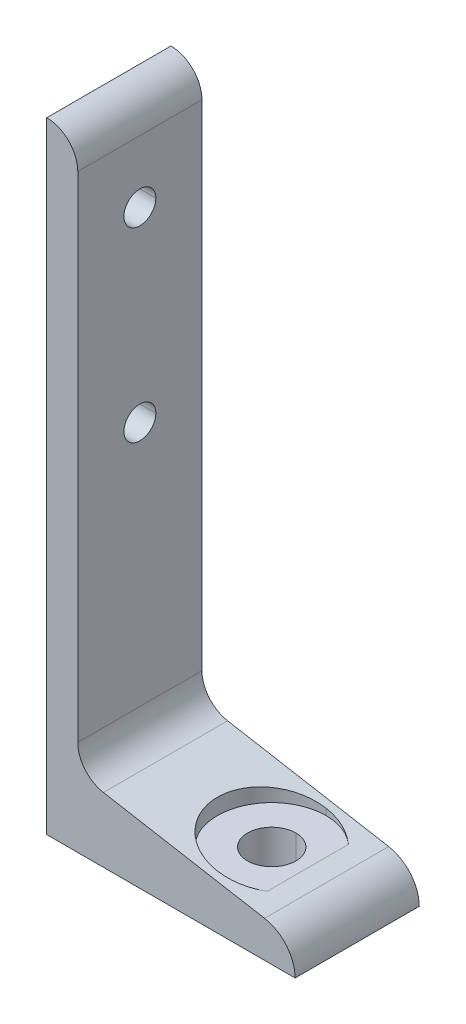
ISO-10303-21;
HEADER;
FILE_DESCRIPTION(('STEP AP214'),'2;1');
FILE_NAME('part.step','',(''),(''),'','','');
FILE_SCHEMA(('AUTOMOTIVE_DESIGN { 1 0 10303 214 1 1 1 1 }'));
ENDSEC;
DATA;
#1=APPLICATION_CONTEXT('core data for automotive mechanical design processes');
#2=APPLICATION_PROTOCOL_DEFINITION('international standard','automotive_design',2000,#1);
#3=PRODUCT_CONTEXT('',#1,'mechanical');
#4=PRODUCT('Part','Part','',(#3));
#5=PRODUCT_RELATED_PRODUCT_CATEGORY('part','',(#4));
#6=PRODUCT_DEFINITION_FORMATION('','',#4);
#7=PRODUCT_DEFINITION_CONTEXT('part definition',#1,'design');
#8=PRODUCT_DEFINITION('design','',#6,#7);
#9=PRODUCT_DEFINITION_SHAPE('','',#8);
#10=(LENGTH_UNIT() NAMED_UNIT(*) SI_UNIT(.MILLI.,.METRE.));
#11=(NAMED_UNIT(*) PLANE_ANGLE_UNIT() SI_UNIT($,.RADIAN.));
#12=(NAMED_UNIT(*) SI_UNIT($,.STERADIAN.) SOLID_ANGLE_UNIT());
#13=UNCERTAINTY_MEASURE_WITH_UNIT(LENGTH_MEASURE(1.E-05),#10,'distance_accuracy_value','');
#14=(GEOMETRIC_REPRESENTATION_CONTEXT(3) GLOBAL_UNCERTAINTY_ASSIGNED_CONTEXT((#13)) GLOBAL_UNIT_ASSIGNED_CONTEXT((#10,
#11,#12)) REPRESENTATION_CONTEXT('',''));
#15=CARTESIAN_POINT('',(0.,0.,0.));
#16=DIRECTION('',(0.,0.,1.));
#17=DIRECTION('',(1.,0.,0.));
#18=AXIS2_PLACEMENT_3D('',#15,#16,#17);
#19=CARTESIAN_POINT('',(50.8,107.95,0.));
#20=DIRECTION('',(-1.,0.,0.));
#21=DIRECTION('',(0.,0.,1.));
#22=AXIS2_PLACEMENT_3D('',#19,#20,#21);
#23=CYLINDRICAL_SURFACE('',#22,3.2639);
#24=DIRECTION('',(-1.,0.,0.));
#25=VECTOR('',#24,1.);
#26=CARTESIAN_POINT('',(50.8,107.95,-3.2639));
#27=LINE('',#26,#25);
#28=CARTESIAN_POINT('',(6.35,107.95,-3.2639));
#29=VERTEX_POINT('',#28);
#30=CARTESIAN_POINT('',(0.,107.95,-3.2639));
#31=VERTEX_POINT('',#30);
#32=EDGE_CURVE('E175',#29,#31,#27,.T.);
#33=ORIENTED_EDGE('',*,*,#32,.F.);
#34=CARTESIAN_POINT('',(6.35,107.95,0.));
#35=DIRECTION('',(1.,0.,0.));
#36=DIRECTION('',(0.,-1.,0.));
#37=AXIS2_PLACEMENT_3D('',#34,#35,#36);
#38=CIRCLE('',#37,3.2639);
#39=CARTESIAN_POINT('',(6.35,107.95,3.2639));
#40=VERTEX_POINT('',#39);
#41=EDGE_CURVE('E170',#29,#40,#38,.T.);
#42=ORIENTED_EDGE('',*,*,#41,.T.);
#43=DIRECTION('',(-1.,0.,0.));
#44=VECTOR('',#43,1.);
#45=CARTESIAN_POINT('',(50.8,107.95,3.2639));
#46=LINE('',#45,#44);
#47=CARTESIAN_POINT('',(0.,107.95,3.2639));
#48=VERTEX_POINT('',#47);
#49=EDGE_CURVE('E172',#40,#48,#46,.T.);
#50=ORIENTED_EDGE('',*,*,#49,.T.);
#51=CARTESIAN_POINT('',(0.,107.95,0.));
#52=DIRECTION('',(1.,0.,0.));
#53=DIRECTION('',(0.,0.,-1.));
#54=AXIS2_PLACEMENT_3D('',#51,#52,#53);
#55=CIRCLE('',#54,3.2639);
#56=EDGE_CURVE('E267',#31,#48,#55,.T.);
#57=ORIENTED_EDGE('',*,*,#56,.F.);
#58=EDGE_LOOP('',(#33,#42,#50,#57));
#59=FACE_BOUND('',#58,.T.);
#60=ADVANCED_FACE('F16',(#59),#23,.F.);
#61=CARTESIAN_POINT('',(50.8,69.85,0.));
#62=DIRECTION('',(-1.,0.,0.));
#63=DIRECTION('',(0.,0.,1.));
#64=AXIS2_PLACEMENT_3D('',#61,#62,#63);
#65=CYLINDRICAL_SURFACE('',#64,3.2639);
#66=DIRECTION('',(-1.,0.,0.));
#67=VECTOR('',#66,1.);
#68=CARTESIAN_POINT('',(50.8,69.85,-3.2639));
#69=LINE('',#68,#67);
#70=CARTESIAN_POINT('',(6.35,69.85,-3.2639));
#71=VERTEX_POINT('',#70);
#72=CARTESIAN_POINT('',(0.,69.85,-3.2639));
#73=VERTEX_POINT('',#72);
#74=EDGE_CURVE('E207',#71,#73,#69,.T.);
#75=ORIENTED_EDGE('',*,*,#74,.F.);
#76=CARTESIAN_POINT('',(6.35,69.85,0.));
#77=DIRECTION('',(1.,0.,0.));
#78=DIRECTION('',(0.,-1.,0.));
#79=AXIS2_PLACEMENT_3D('',#76,#77,#78);
#80=CIRCLE('',#79,3.2639);
#81=CARTESIAN_POINT('',(6.35,69.85,3.2639));
#82=VERTEX_POINT('',#81);
#83=EDGE_CURVE('E181',#71,#82,#80,.T.);
#84=ORIENTED_EDGE('',*,*,#83,.T.);
#85=DIRECTION('',(-1.,0.,0.));
#86=VECTOR('',#85,1.);
#87=CARTESIAN_POINT('',(50.8,69.85,3.2639));
#88=LINE('',#87,#86);
#89=CARTESIAN_POINT('',(0.,69.85,3.2639));
#90=VERTEX_POINT('',#89);
#91=EDGE_CURVE('E206',#82,#90,#88,.T.);
#92=ORIENTED_EDGE('',*,*,#91,.T.);
#93=CARTESIAN_POINT('',(0.,69.85,0.));
#94=DIRECTION('',(1.,0.,0.));
#95=DIRECTION('',(0.,0.,-1.));
#96=AXIS2_PLACEMENT_3D('',#93,#94,#95);
#97=CIRCLE('',#96,3.2639);
#98=EDGE_CURVE('E316',#73,#90,#97,.T.);
#99=ORIENTED_EDGE('',*,*,#98,.F.);
#100=EDGE_LOOP('',(#75,#84,#92,#99));
#101=FACE_BOUND('',#100,.T.);
#102=ADVANCED_FACE('F500',(#101),#65,.F.);
#103=CARTESIAN_POINT('',(33.3248,8.128,0.));
#104=DIRECTION('',(0.,1.,0.));
#105=DIRECTION('',(1.,0.,0.));
#106=AXIS2_PLACEMENT_3D('',#103,#104,#105);
#107=PLANE('',#106);
#108=CARTESIAN_POINT('',(33.3248,8.128,0.));
#109=DIRECTION('',(0.,1.,0.));
#110=DIRECTION('',(0.,0.,1.));
#111=AXIS2_PLACEMENT_3D('',#108,#109,#110);
#112=CIRCLE('',#111,4.953);
#113=CARTESIAN_POINT('',(33.3248,8.128,-4.953));
#114=VERTEX_POINT('',#113);
#115=CARTESIAN_POINT('',(33.3248,8.128,4.953));
#116=VERTEX_POINT('',#115);
#117=EDGE_CURVE('E259',#114,#116,#112,.T.);
#118=ORIENTED_EDGE('',*,*,#117,.F.);
#119=CARTESIAN_POINT('',(33.3248,8.128,0.));
#120=DIRECTION('',(0.,1.,0.));
#121=DIRECTION('',(0.,0.,1.));
#122=AXIS2_PLACEMENT_3D('',#119,#120,#121);
#123=CIRCLE('',#122,4.953);
#124=EDGE_CURVE('E329',#116,#114,#123,.T.);
#125=ORIENTED_EDGE('',*,*,#124,.F.);
#126=EDGE_LOOP('',(#118,#125));
#127=FACE_BOUND('',#126,.T.);
#128=DIRECTION('',(0.,0.,-1.));
#129=VECTOR('',#128,1.);
#130=CARTESIAN_POINT('',(40.7164609247193,8.128,12.7));
#131=LINE('',#130,#129);
#132=CARTESIAN_POINT('',(40.7164609247193,8.128,8.29765057254029));
#133=VERTEX_POINT('',#132);
#134=CARTESIAN_POINT('',(40.7164609247193,8.128,-8.29765057254029));
#135=VERTEX_POINT('',#134);
#136=EDGE_CURVE('E260',#133,#135,#131,.T.);
#137=ORIENTED_EDGE('',*,*,#136,.T.);
#138=CARTESIAN_POINT('',(33.3248,8.128,0.));
#139=DIRECTION('',(0.,1.,0.));
#140=DIRECTION('',(0.,0.,1.));
#141=AXIS2_PLACEMENT_3D('',#138,#139,#140);
#142=CIRCLE('',#141,11.1125);
#143=CARTESIAN_POINT('',(33.3248,8.128,-11.1125));
#144=VERTEX_POINT('',#143);
#145=EDGE_CURVE('E250',#135,#144,#142,.T.);
#146=ORIENTED_EDGE('',*,*,#145,.T.);
#147=CARTESIAN_POINT('',(33.3248,8.128,0.));
#148=DIRECTION('',(0.,1.,0.));
#149=DIRECTION('',(0.,0.,1.));
#150=AXIS2_PLACEMENT_3D('',#147,#148,#149);
#151=CIRCLE('',#150,11.1125);
#152=CARTESIAN_POINT('',(33.3248,8.128,11.1125));
#153=VERTEX_POINT('',#152);
#154=EDGE_CURVE('E229',#144,#153,#151,.T.);
#155=ORIENTED_EDGE('',*,*,#154,.T.);
#156=CARTESIAN_POINT('',(33.3248,8.128,0.));
#157=DIRECTION('',(0.,1.,0.));
#158=DIRECTION('',(0.,0.,1.));
#159=AXIS2_PLACEMENT_3D('',#156,#157,#158);
#160=CIRCLE('',#159,11.1125);
#161=EDGE_CURVE('E10',#153,#133,#160,.T.);
#162=ORIENTED_EDGE('',*,*,#161,.T.);
#163=EDGE_LOOP('',(#137,#146,#155,#162));
#164=FACE_BOUND('',#163,.T.);
#165=ADVANCED_FACE('F406',(#127,#164),#107,.T.);
#166=CARTESIAN_POINT('',(33.3248,127.,0.));
#167=DIRECTION('',(0.,-1.,0.));
#168=DIRECTION('',(0.,0.,-1.));
#169=AXIS2_PLACEMENT_3D('',#166,#167,#168);
#170=CYLINDRICAL_SURFACE('',#169,11.1125);
#171=DIRECTION('',(0.,-1.,0.));
#172=VECTOR('',#171,1.);
#173=CARTESIAN_POINT('',(33.3248,127.,11.1125));
#174=LINE('',#173,#172);
#175=CARTESIAN_POINT('',(33.3248,9.43134925327645,11.1125));
#176=VERTEX_POINT('',#175);
#177=EDGE_CURVE('E238',#176,#153,#174,.T.);
#178=ORIENTED_EDGE('',*,*,#177,.F.);
#179=CARTESIAN_POINT('',(33.3248,9.43134925327645,11.1125));
#180=CARTESIAN_POINT('',(36.081621391566,8.94524726094913,11.1125));
#181=CARTESIAN_POINT('',(38.6579555840562,8.49097003149137,10.1313953605239));
#182=CARTESIAN_POINT('',(40.7164609247193,8.128,8.29765057254029));
#183=(BOUNDED_CURVE() B_SPLINE_CURVE(3,(#179,#180,#181,#182),.UNSPECIFIED.,.F.,
.F.) B_SPLINE_CURVE_WITH_KNOTS((4,4),(4.71238898038469,5.4401055411194),
.UNSPECIFIED.) CURVE() GEOMETRIC_REPRESENTATION_ITEM() RATIONAL_B_SPLINE_CURVE((1.,
0.956353792178216,0.956353792178216,1.)) REPRESENTATION_ITEM(''));
#184=EDGE_CURVE('E263',#176,#133,#183,.T.);
#185=ORIENTED_EDGE('',*,*,#184,.T.);
#186=ORIENTED_EDGE('',*,*,#161,.F.);
#187=EDGE_LOOP('',(#178,#185,#186));
#188=FACE_BOUND('',#187,.T.);
#189=ADVANCED_FACE('F401',(#188),#170,.F.);
#190=CARTESIAN_POINT('',(0.,120.65,-12.7));
#191=DIRECTION('',(0.,0.,1.));
#192=DIRECTION('',(1.,0.,0.));
#193=AXIS2_PLACEMENT_3D('',#190,#191,#192);
#194=PLANE('',#193);
#195=DIRECTION('',(1.,0.,0.));
#196=VECTOR('',#195,1.);
#197=CARTESIAN_POINT('',(50.8,0.,-12.7));
#198=LINE('',#197,#196);
#199=CARTESIAN_POINT('',(0.,0.,-12.7));
#200=VERTEX_POINT('',#199);
#201=CARTESIAN_POINT('',(50.8,0.,-12.7));
#202=VERTEX_POINT('',#201);
#203=EDGE_CURVE('E338',#200,#202,#198,.T.);
#204=ORIENTED_EDGE('',*,*,#203,.F.);
#205=DIRECTION('',(0.,-1.,0.));
#206=VECTOR('',#205,1.);
#207=CARTESIAN_POINT('',(0.,0.,-12.7));
#208=LINE('',#207,#206);
#209=CARTESIAN_POINT('',(0.,127.,-12.7));
#210=VERTEX_POINT('',#209);
#211=EDGE_CURVE('E180',#210,#200,#208,.T.);
#212=ORIENTED_EDGE('',*,*,#211,.F.);
#213=CARTESIAN_POINT('',(0.,120.65,-12.7));
#214=DIRECTION('',(0.,0.,1.));
#215=DIRECTION('',(1.,0.,0.));
#216=AXIS2_PLACEMENT_3D('',#213,#214,#215);
#217=CIRCLE('',#216,6.35);
#218=CARTESIAN_POINT('',(6.35,120.65,-12.7));
#219=VERTEX_POINT('',#218);
#220=EDGE_CURVE('E356',#219,#210,#217,.T.);
#221=ORIENTED_EDGE('',*,*,#220,.F.);
#222=DIRECTION('',(0.,1.,0.));
#223=VECTOR('',#222,1.);
#224=CARTESIAN_POINT('',(6.35,120.65,-12.7));
#225=LINE('',#224,#223);
#226=CARTESIAN_POINT('',(6.35,19.5160169504667,-12.7));
#227=VERTEX_POINT('',#226);
#228=EDGE_CURVE('E283',#227,#219,#225,.T.);
#229=ORIENTED_EDGE('',*,*,#228,.F.);
#230=CARTESIAN_POINT('',(12.7,19.5160169504667,-12.7));
#231=DIRECTION('',(0.,0.,-1.));
#232=DIRECTION('',(1.,0.,0.));
#233=AXIS2_PLACEMENT_3D('',#230,#231,#232);
#234=CIRCLE('',#233,6.35);
#235=CARTESIAN_POINT('',(11.597334071815,13.2624877188392,-12.7));
#236=VERTEX_POINT('',#235);
#237=EDGE_CURVE('E352',#236,#227,#234,.T.);
#238=ORIENTED_EDGE('',*,*,#237,.F.);
#239=DIRECTION('',(-0.984807753012209,0.173648177666924,0.));
#240=VECTOR('',#239,1.);
#241=CARTESIAN_POINT('',(11.597334071815,13.2624877188392,-12.7));
#242=LINE('',#241,#240);
#243=CARTESIAN_POINT('',(44.5464707683724,7.45266592818496,-12.7));
#244=VERTEX_POINT('',#243);
#245=EDGE_CURVE('E216',#244,#236,#242,.T.);
#246=ORIENTED_EDGE('',*,*,#245,.F.);
#247=CARTESIAN_POINT('',(43.2323646870268,0.,-12.7));
#248=DIRECTION('',(0.,0.,1.));
#249=DIRECTION('',(1.,0.,0.));
#250=AXIS2_PLACEMENT_3D('',#247,#248,#249);
#251=CIRCLE('',#250,7.56763531297318);
#252=EDGE_CURVE('E49',#202,#244,#251,.T.);
#253=ORIENTED_EDGE('',*,*,#252,.F.);
#254=EDGE_LOOP('',(#204,#212,#221,#229,#238,#246,#253));
#255=FACE_BOUND('',#254,.T.);
#256=ADVANCED_FACE('F405',(#255),#194,.F.);
#257=CARTESIAN_POINT('',(0.,120.65,12.7));
#258=DIRECTION('',(0.,0.,1.));
#259=DIRECTION('',(1.,0.,0.));
#260=AXIS2_PLACEMENT_3D('',#257,#258,#259);
#261=PLANE('',#260);
#262=DIRECTION('',(1.,0.,0.));
#263=VECTOR('',#262,1.);
#264=CARTESIAN_POINT('',(50.8,0.,12.7));
#265=LINE('',#264,#263);
#266=CARTESIAN_POINT('',(0.,0.,12.7));
#267=VERTEX_POINT('',#266);
#268=CARTESIAN_POINT('',(50.8,0.,12.7));
#269=VERTEX_POINT('',#268);
#270=EDGE_CURVE('E345',#267,#269,#265,.T.);
#271=ORIENTED_EDGE('',*,*,#270,.T.);
#272=CARTESIAN_POINT('',(43.2323646870268,0.,12.7));
#273=DIRECTION('',(0.,0.,1.));
#274=DIRECTION('',(1.,0.,0.));
#275=AXIS2_PLACEMENT_3D('',#272,#273,#274);
#276=CIRCLE('',#275,7.56763531297318);
#277=CARTESIAN_POINT('',(44.5464707683724,7.45266592818496,12.7));
#278=VERTEX_POINT('',#277);
#279=EDGE_CURVE('E38',#269,#278,#276,.T.);
#280=ORIENTED_EDGE('',*,*,#279,.T.);
#281=DIRECTION('',(-0.984807753012209,0.173648177666924,0.));
#282=VECTOR('',#281,1.);
#283=CARTESIAN_POINT('',(11.597334071815,13.2624877188392,12.7));
#284=LINE('',#283,#282);
#285=CARTESIAN_POINT('',(11.597334071815,13.2624877188392,12.7));
#286=VERTEX_POINT('',#285);
#287=EDGE_CURVE('E215',#278,#286,#284,.T.);
#288=ORIENTED_EDGE('',*,*,#287,.T.);
#289=CARTESIAN_POINT('',(12.7,19.5160169504667,12.7));
#290=DIRECTION('',(0.,0.,-1.));
#291=DIRECTION('',(1.,0.,0.));
#292=AXIS2_PLACEMENT_3D('',#289,#290,#291);
#293=CIRCLE('',#292,6.35);
#294=CARTESIAN_POINT('',(6.35,19.5160169504667,12.7));
#295=VERTEX_POINT('',#294);
#296=EDGE_CURVE('E355',#286,#295,#293,.T.);
#297=ORIENTED_EDGE('',*,*,#296,.T.);
#298=DIRECTION('',(0.,1.,0.));
#299=VECTOR('',#298,1.);
#300=CARTESIAN_POINT('',(6.35,120.65,12.7));
#301=LINE('',#300,#299);
#302=CARTESIAN_POINT('',(6.35,120.65,12.7));
#303=VERTEX_POINT('',#302);
#304=EDGE_CURVE('E291',#295,#303,#301,.T.);
#305=ORIENTED_EDGE('',*,*,#304,.T.);
#306=CARTESIAN_POINT('',(0.,120.65,12.7));
#307=DIRECTION('',(0.,0.,1.));
#308=DIRECTION('',(1.,0.,0.));
#309=AXIS2_PLACEMENT_3D('',#306,#307,#308);
#310=CIRCLE('',#309,6.35);
#311=CARTESIAN_POINT('',(0.,127.,12.7));
#312=VERTEX_POINT('',#311);
#313=EDGE_CURVE('E19',#303,#312,#310,.T.);
#314=ORIENTED_EDGE('',*,*,#313,.T.);
#315=DIRECTION('',(0.,-1.,0.));
#316=VECTOR('',#315,1.);
#317=CARTESIAN_POINT('',(0.,0.,12.7));
#318=LINE('',#317,#316);
#319=EDGE_CURVE('E308',#312,#267,#318,.T.);
#320=ORIENTED_EDGE('',*,*,#319,.T.);
#321=EDGE_LOOP('',(#271,#280,#288,#297,#305,#314,#320));
#322=FACE_BOUND('',#321,.T.);
#323=ADVANCED_FACE('F362',(#322),#261,.T.);
#324=CARTESIAN_POINT('',(0.,120.65,12.7));
#325=DIRECTION('',(0.,0.,-1.));
#326=DIRECTION('',(-1.,0.,0.));
#327=AXIS2_PLACEMENT_3D('',#324,#325,#326);
#328=CYLINDRICAL_SURFACE('',#327,6.35);
#329=ORIENTED_EDGE('',*,*,#220,.T.);
#330=DIRECTION('',(0.,0.,-1.));
#331=VECTOR('',#330,1.);
#332=CARTESIAN_POINT('',(0.,127.,12.7));
#333=LINE('',#332,#331);
#334=EDGE_CURVE('E312',#312,#210,#333,.T.);
#335=ORIENTED_EDGE('',*,*,#334,.F.);
#336=ORIENTED_EDGE('',*,*,#313,.F.);
#337=DIRECTION('',(0.,0.,-1.));
#338=VECTOR('',#337,1.);
#339=CARTESIAN_POINT('',(6.35,120.65,12.7));
#340=LINE('',#339,#338);
#341=EDGE_CURVE('E287',#303,#219,#340,.T.);
#342=ORIENTED_EDGE('',*,*,#341,.T.);
#343=EDGE_LOOP('',(#329,#335,#336,#342));
#344=FACE_BOUND('',#343,.T.);
#345=ADVANCED_FACE('F372',(#344),#328,.T.);
#346=CARTESIAN_POINT('',(12.7,19.5160169504667,12.7));
#347=DIRECTION('',(0.,0.,-1.));
#348=DIRECTION('',(-1.,0.,0.));
#349=AXIS2_PLACEMENT_3D('',#346,#347,#348);
#350=CYLINDRICAL_SURFACE('',#349,6.35);
#351=ORIENTED_EDGE('',*,*,#237,.T.);
#352=DIRECTION('',(0.,0.,-1.));
#353=VECTOR('',#352,1.);
#354=CARTESIAN_POINT('',(6.35,19.5160169504667,12.7));
#355=LINE('',#354,#353);
#356=EDGE_CURVE('E295',#295,#227,#355,.T.);
#357=ORIENTED_EDGE('',*,*,#356,.F.);
#358=ORIENTED_EDGE('',*,*,#296,.F.);
#359=DIRECTION('',(0.,0.,-1.));
#360=VECTOR('',#359,1.);
#361=CARTESIAN_POINT('',(11.597334071815,13.2624877188392,12.7));
#362=LINE('',#361,#360);
#363=EDGE_CURVE('E211',#286,#236,#362,.T.);
#364=ORIENTED_EDGE('',*,*,#363,.T.);
#365=EDGE_LOOP('',(#351,#357,#358,#364));
#366=FACE_BOUND('',#365,.T.);
#367=ADVANCED_FACE('F368',(#366),#350,.F.);
#368=CARTESIAN_POINT('',(43.2323646870268,0.,12.7));
#369=DIRECTION('',(0.,0.,-1.));
#370=DIRECTION('',(-1.,0.,0.));
#371=AXIS2_PLACEMENT_3D('',#368,#369,#370);
#372=CYLINDRICAL_SURFACE('',#371,7.56763531297318);
#373=ORIENTED_EDGE('',*,*,#252,.T.);
#374=DIRECTION('',(0.,0.,-1.));
#375=VECTOR('',#374,1.);
#376=CARTESIAN_POINT('',(44.5464707683724,7.45266592818496,12.7));
#377=LINE('',#376,#375);
#378=EDGE_CURVE('E223',#278,#244,#377,.T.);
#379=ORIENTED_EDGE('',*,*,#378,.F.);
#380=ORIENTED_EDGE('',*,*,#279,.F.);
#381=DIRECTION('',(0.,0.,-1.));
#382=VECTOR('',#381,1.);
#383=CARTESIAN_POINT('',(50.8,0.,12.7));
#384=LINE('',#383,#382);
#385=EDGE_CURVE('E342',#269,#202,#384,.T.);
#386=ORIENTED_EDGE('',*,*,#385,.T.);
#387=EDGE_LOOP('',(#373,#379,#380,#386));
#388=FACE_BOUND('',#387,.T.);
#389=ADVANCED_FACE('F509',(#388),#372,.T.);
#390=CARTESIAN_POINT('',(50.8,0.,12.7));
#391=DIRECTION('',(0.,1.,0.));
#392=DIRECTION('',(1.,0.,0.));
#393=AXIS2_PLACEMENT_3D('',#390,#391,#392);
#394=PLANE('',#393);
#395=CARTESIAN_POINT('',(33.3248,0.,0.));
#396=DIRECTION('',(0.,1.,0.));
#397=DIRECTION('',(0.,0.,1.));
#398=AXIS2_PLACEMENT_3D('',#395,#396,#397);
#399=CIRCLE('',#398,4.953);
#400=CARTESIAN_POINT('',(33.3248,0.,-4.953));
#401=VERTEX_POINT('',#400);
#402=CARTESIAN_POINT('',(33.3248,0.,4.953));
#403=VERTEX_POINT('',#402);
#404=EDGE_CURVE('E272',#401,#403,#399,.T.);
#405=ORIENTED_EDGE('',*,*,#404,.T.);
#406=CARTESIAN_POINT('',(33.3248,0.,0.));
#407=DIRECTION('',(0.,1.,0.));
#408=DIRECTION('',(0.,0.,1.));
#409=AXIS2_PLACEMENT_3D('',#406,#407,#408);
#410=CIRCLE('',#409,4.953);
#411=EDGE_CURVE('E335',#403,#401,#410,.T.);
#412=ORIENTED_EDGE('',*,*,#411,.T.);
#413=EDGE_LOOP('',(#405,#412));
#414=FACE_BOUND('',#413,.T.);
#415=ORIENTED_EDGE('',*,*,#203,.T.);
#416=ORIENTED_EDGE('',*,*,#385,.F.);
#417=ORIENTED_EDGE('',*,*,#270,.F.);
#418=DIRECTION('',(0.,0.,-1.));
#419=VECTOR('',#418,1.);
#420=CARTESIAN_POINT('',(0.,0.,12.7));
#421=LINE('',#420,#419);
#422=EDGE_CURVE('E304',#267,#200,#421,.T.);
#423=ORIENTED_EDGE('',*,*,#422,.T.);
#424=EDGE_LOOP('',(#415,#416,#417,#423));
#425=FACE_BOUND('',#424,.T.);
#426=ADVANCED_FACE('F491',(#414,#425),#394,.F.);
#427=CARTESIAN_POINT('',(33.3248,127.,0.));
#428=DIRECTION('',(0.,-1.,0.));
#429=DIRECTION('',(0.,0.,-1.));
#430=AXIS2_PLACEMENT_3D('',#427,#428,#429);
#431=CYLINDRICAL_SURFACE('',#430,4.953);
#432=DIRECTION('',(0.,-1.,0.));
#433=VECTOR('',#432,1.);
#434=CARTESIAN_POINT('',(33.3248,127.,4.953));
#435=LINE('',#434,#433);
#436=EDGE_CURVE('E268',#116,#403,#435,.T.);
#437=ORIENTED_EDGE('',*,*,#436,.F.);
#438=ORIENTED_EDGE('',*,*,#124,.T.);
#439=DIRECTION('',(0.,-1.,0.));
#440=VECTOR('',#439,1.);
#441=CARTESIAN_POINT('',(33.3248,127.,-4.953));
#442=LINE('',#441,#440);
#443=EDGE_CURVE('E279',#114,#401,#442,.T.);
#444=ORIENTED_EDGE('',*,*,#443,.T.);
#445=ORIENTED_EDGE('',*,*,#411,.F.);
#446=EDGE_LOOP('',(#437,#438,#444,#445));
#447=FACE_BOUND('',#446,.T.);
#448=ADVANCED_FACE('F432',(#447),#431,.F.);
#449=CARTESIAN_POINT('',(11.597334071815,13.2624877188392,12.7));
#450=DIRECTION('',(-0.173648177666924,-0.984807753012209,0.));
#451=DIRECTION('',(-0.984807753012209,0.173648177666924,0.));
#452=AXIS2_PLACEMENT_3D('',#449,#450,#451);
#453=PLANE('',#452);
#454=CARTESIAN_POINT('',(40.7164609247193,8.128,-8.29765057254029));
#455=CARTESIAN_POINT('',(38.6579555840562,8.49097003149137,-10.1313953605239));
#456=CARTESIAN_POINT('',(36.081621391566,8.94524726094913,-11.1125));
#457=CARTESIAN_POINT('',(33.3248,9.43134925327645,-11.1125));
#458=(BOUNDED_CURVE() B_SPLINE_CURVE(3,(#454,#455,#456,#457),.UNSPECIFIED.,.F.,
.F.) B_SPLINE_CURVE_WITH_KNOTS((4,4),(0.84307976606019,1.5707963267949),
.UNSPECIFIED.) CURVE() GEOMETRIC_REPRESENTATION_ITEM() RATIONAL_B_SPLINE_CURVE((1.,
0.956353792178216,0.956353792178216,1.)) REPRESENTATION_ITEM(''));
#459=CARTESIAN_POINT('',(33.3248,9.43134925327645,-11.1125));
#460=VERTEX_POINT('',#459);
#461=EDGE_CURVE('E228',#135,#460,#458,.T.);
#462=ORIENTED_EDGE('',*,*,#461,.F.);
#463=ORIENTED_EDGE('',*,*,#136,.F.);
#464=ORIENTED_EDGE('',*,*,#184,.F.);
#465=CARTESIAN_POINT('',(33.3248,9.43134925327645,-11.1125));
#466=CARTESIAN_POINT('',(11.0998,13.3502163995219,-11.1125));
#467=CARTESIAN_POINT('',(11.0998,13.3502163995219,11.1125));
#468=CARTESIAN_POINT('',(33.3248,9.43134925327645,11.1125));
#469=(BOUNDED_CURVE() B_SPLINE_CURVE(3,(#465,#466,#467,#468),.UNSPECIFIED.,.F.,
.F.) B_SPLINE_CURVE_WITH_KNOTS((4,4),(1.5707963267949,4.71238898038469),
.UNSPECIFIED.) CURVE() GEOMETRIC_REPRESENTATION_ITEM() RATIONAL_B_SPLINE_CURVE((1.,
0.333333333333334,0.333333333333334,1.)) REPRESENTATION_ITEM(''));
#470=EDGE_CURVE('E232',#460,#176,#469,.T.);
#471=ORIENTED_EDGE('',*,*,#470,.F.);
#472=EDGE_LOOP('',(#462,#463,#464,#471));
#473=FACE_BOUND('',#472,.T.);
#474=ORIENTED_EDGE('',*,*,#245,.T.);
#475=ORIENTED_EDGE('',*,*,#363,.F.);
#476=ORIENTED_EDGE('',*,*,#287,.F.);
#477=ORIENTED_EDGE('',*,*,#378,.T.);
#478=EDGE_LOOP('',(#474,#475,#476,#477));
#479=FACE_BOUND('',#478,.T.);
#480=ADVANCED_FACE('F427',(#473,#479),#453,.F.);
#481=CARTESIAN_POINT('',(0.,0.,12.7));
#482=DIRECTION('',(1.,0.,0.));
#483=DIRECTION('',(0.,1.,0.));
#484=AXIS2_PLACEMENT_3D('',#481,#482,#483);
#485=PLANE('',#484);
#486=CARTESIAN_POINT('',(0.,107.95,0.));
#487=DIRECTION('',(1.,0.,0.));
#488=DIRECTION('',(0.,0.,-1.));
#489=AXIS2_PLACEMENT_3D('',#486,#487,#488);
#490=CIRCLE('',#489,3.2639);
#491=EDGE_CURVE('E187',#48,#31,#490,.T.);
#492=ORIENTED_EDGE('',*,*,#491,.T.);
#493=ORIENTED_EDGE('',*,*,#56,.T.);
#494=EDGE_LOOP('',(#492,#493));
#495=FACE_BOUND('',#494,.T.);
#496=CARTESIAN_POINT('',(0.,69.85,0.));
#497=DIRECTION('',(1.,0.,0.));
#498=DIRECTION('',(0.,0.,-1.));
#499=AXIS2_PLACEMENT_3D('',#496,#497,#498);
#500=CIRCLE('',#499,3.2639);
#501=EDGE_CURVE('E202',#90,#73,#500,.T.);
#502=ORIENTED_EDGE('',*,*,#501,.T.);
#503=ORIENTED_EDGE('',*,*,#98,.T.);
#504=EDGE_LOOP('',(#502,#503));
#505=FACE_BOUND('',#504,.T.);
#506=ORIENTED_EDGE('',*,*,#211,.T.);
#507=ORIENTED_EDGE('',*,*,#422,.F.);
#508=ORIENTED_EDGE('',*,*,#319,.F.);
#509=ORIENTED_EDGE('',*,*,#334,.T.);
#510=EDGE_LOOP('',(#506,#507,#508,#509));
#511=FACE_BOUND('',#510,.T.);
#512=ADVANCED_FACE('F431',(#495,#505,#511),#485,.F.);
#513=CARTESIAN_POINT('',(6.35,120.65,12.7));
#514=DIRECTION('',(-1.,0.,0.));
#515=DIRECTION('',(0.,1.,0.));
#516=AXIS2_PLACEMENT_3D('',#513,#514,#515);
#517=PLANE('',#516);
#518=CARTESIAN_POINT('',(6.35,107.95,0.));
#519=DIRECTION('',(1.,0.,0.));
#520=DIRECTION('',(0.,-1.,0.));
#521=AXIS2_PLACEMENT_3D('',#518,#519,#520);
#522=CIRCLE('',#521,3.2639);
#523=EDGE_CURVE('E185',#40,#29,#522,.T.);
#524=ORIENTED_EDGE('',*,*,#523,.F.);
#525=ORIENTED_EDGE('',*,*,#41,.F.);
#526=EDGE_LOOP('',(#524,#525));
#527=FACE_BOUND('',#526,.T.);
#528=CARTESIAN_POINT('',(6.35,69.85,0.));
#529=DIRECTION('',(1.,0.,0.));
#530=DIRECTION('',(0.,-1.,0.));
#531=AXIS2_PLACEMENT_3D('',#528,#529,#530);
#532=CIRCLE('',#531,3.2639);
#533=EDGE_CURVE('E189',#82,#71,#532,.T.);
#534=ORIENTED_EDGE('',*,*,#533,.F.);
#535=ORIENTED_EDGE('',*,*,#83,.F.);
#536=EDGE_LOOP('',(#534,#535));
#537=FACE_BOUND('',#536,.T.);
#538=ORIENTED_EDGE('',*,*,#228,.T.);
#539=ORIENTED_EDGE('',*,*,#341,.F.);
#540=ORIENTED_EDGE('',*,*,#304,.F.);
#541=ORIENTED_EDGE('',*,*,#356,.T.);
#542=EDGE_LOOP('',(#538,#539,#540,#541));
#543=FACE_BOUND('',#542,.T.);
#544=ADVANCED_FACE('F191',(#527,#537,#543),#517,.F.);
#545=CARTESIAN_POINT('',(33.3248,127.,0.));
#546=DIRECTION('',(0.,-1.,0.));
#547=DIRECTION('',(0.,0.,-1.));
#548=AXIS2_PLACEMENT_3D('',#545,#546,#547);
#549=CYLINDRICAL_SURFACE('',#548,4.953);
#550=ORIENTED_EDGE('',*,*,#117,.T.);
#551=ORIENTED_EDGE('',*,*,#436,.T.);
#552=ORIENTED_EDGE('',*,*,#404,.F.);
#553=ORIENTED_EDGE('',*,*,#443,.F.);
#554=EDGE_LOOP('',(#550,#551,#552,#553));
#555=FACE_BOUND('',#554,.T.);
#556=ADVANCED_FACE('F446',(#555),#549,.F.);
#557=CARTESIAN_POINT('',(33.3248,127.,0.));
#558=DIRECTION('',(0.,-1.,0.));
#559=DIRECTION('',(0.,0.,-1.));
#560=AXIS2_PLACEMENT_3D('',#557,#558,#559);
#561=CYLINDRICAL_SURFACE('',#560,11.1125);
#562=ORIENTED_EDGE('',*,*,#461,.T.);
#563=DIRECTION('',(0.,-1.,0.));
#564=VECTOR('',#563,1.);
#565=CARTESIAN_POINT('',(33.3248,127.,-11.1125));
#566=LINE('',#565,#564);
#567=EDGE_CURVE('E224',#460,#144,#566,.T.);
#568=ORIENTED_EDGE('',*,*,#567,.T.);
#569=ORIENTED_EDGE('',*,*,#145,.F.);
#570=EDGE_LOOP('',(#562,#568,#569));
#571=FACE_BOUND('',#570,.T.);
#572=ADVANCED_FACE('F450',(#571),#561,.F.);
#573=CARTESIAN_POINT('',(33.3248,127.,0.));
#574=DIRECTION('',(0.,-1.,0.));
#575=DIRECTION('',(0.,0.,-1.));
#576=AXIS2_PLACEMENT_3D('',#573,#574,#575);
#577=CYLINDRICAL_SURFACE('',#576,11.1125);
#578=ORIENTED_EDGE('',*,*,#470,.T.);
#579=ORIENTED_EDGE('',*,*,#177,.T.);
#580=ORIENTED_EDGE('',*,*,#154,.F.);
#581=ORIENTED_EDGE('',*,*,#567,.F.);
#582=EDGE_LOOP('',(#578,#579,#580,#581));
#583=FACE_BOUND('',#582,.T.);
#584=ADVANCED_FACE('F459',(#583),#577,.F.);
#585=CARTESIAN_POINT('',(50.8,69.85,0.));
#586=DIRECTION('',(-1.,0.,0.));
#587=DIRECTION('',(0.,0.,1.));
#588=AXIS2_PLACEMENT_3D('',#585,#586,#587);
#589=CYLINDRICAL_SURFACE('',#588,3.2639);
#590=ORIENTED_EDGE('',*,*,#533,.T.);
#591=ORIENTED_EDGE('',*,*,#74,.T.);
#592=ORIENTED_EDGE('',*,*,#501,.F.);
#593=ORIENTED_EDGE('',*,*,#91,.F.);
#594=EDGE_LOOP('',(#590,#591,#592,#593));
#595=FACE_BOUND('',#594,.T.);
#596=ADVANCED_FACE('F422',(#595),#589,.F.);
#597=CARTESIAN_POINT('',(50.8,107.95,0.));
#598=DIRECTION('',(-1.,0.,0.));
#599=DIRECTION('',(0.,0.,1.));
#600=AXIS2_PLACEMENT_3D('',#597,#598,#599);
#601=CYLINDRICAL_SURFACE('',#600,3.2639);
#602=ORIENTED_EDGE('',*,*,#523,.T.);
#603=ORIENTED_EDGE('',*,*,#32,.T.);
#604=ORIENTED_EDGE('',*,*,#491,.F.);
#605=ORIENTED_EDGE('',*,*,#49,.F.);
#606=EDGE_LOOP('',(#602,#603,#604,#605));
#607=FACE_BOUND('',#606,.T.);
#608=ADVANCED_FACE('F184',(#607),#601,.F.);
#609=CLOSED_SHELL('',(#60,#102,#165,#189,#256,#323,#345,#367,#389,#426,#448,#480,#512,#544,#556,
#572,#584,#596,#608));
#610=MANIFOLD_SOLID_BREP('B1',#609);
#611=ADVANCED_BREP_SHAPE_REPRESENTATION('',(#18,#610),#14);
#612=SHAPE_DEFINITION_REPRESENTATION(#9,#611);
ENDSEC;
END-ISO-10303-21;
